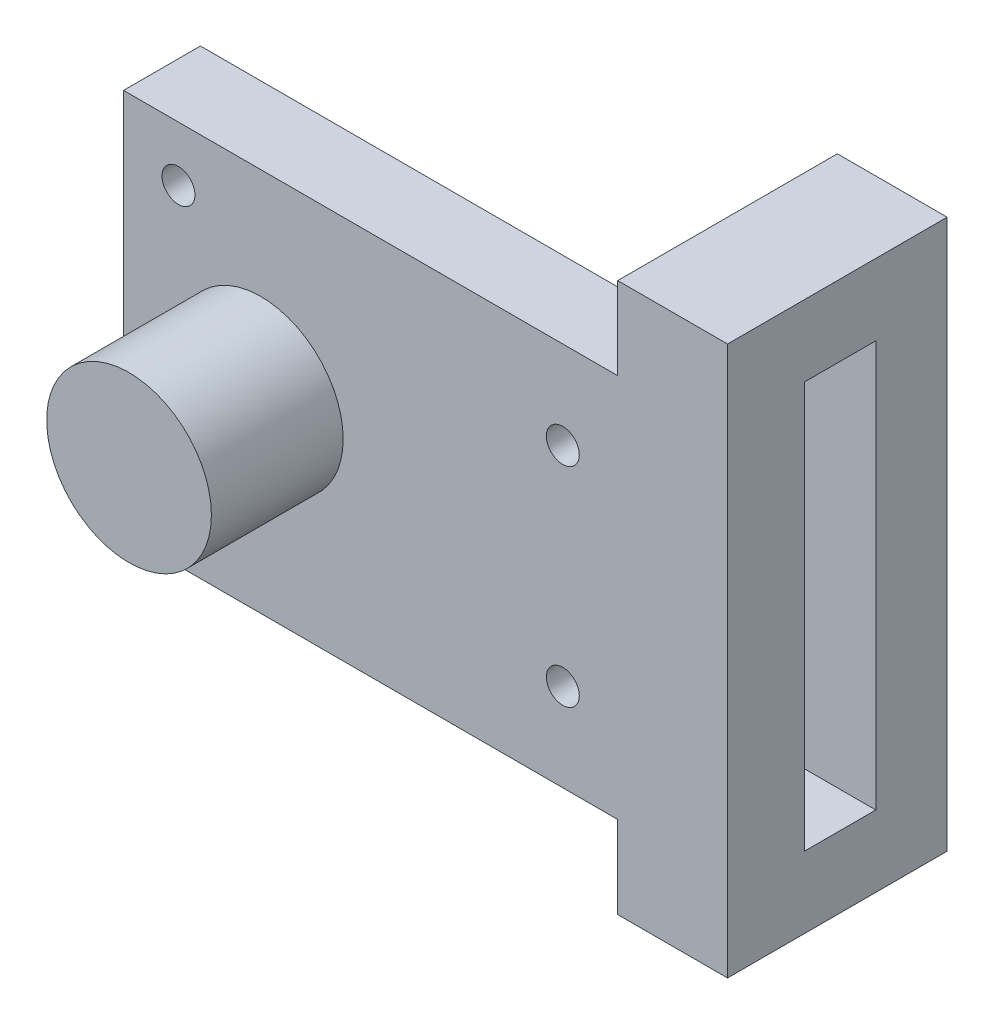
ISO-10303-21;
HEADER;
FILE_DESCRIPTION(('STEP AP214'),'2;1');
FILE_NAME('part.step','',(''),(''),'','','');
FILE_SCHEMA(('AUTOMOTIVE_DESIGN { 1 0 10303 214 1 1 1 1 }'));
ENDSEC;
DATA;
#1=APPLICATION_CONTEXT('core data for automotive mechanical design processes');
#2=APPLICATION_PROTOCOL_DEFINITION('international standard','automotive_design',2000,#1);
#3=PRODUCT_CONTEXT('',#1,'mechanical');
#4=PRODUCT('Part','Part','',(#3));
#5=PRODUCT_RELATED_PRODUCT_CATEGORY('part','',(#4));
#6=PRODUCT_DEFINITION_FORMATION('','',#4);
#7=PRODUCT_DEFINITION_CONTEXT('part definition',#1,'design');
#8=PRODUCT_DEFINITION('design','',#6,#7);
#9=PRODUCT_DEFINITION_SHAPE('','',#8);
#10=(LENGTH_UNIT() NAMED_UNIT(*) SI_UNIT(.MILLI.,.METRE.));
#11=(NAMED_UNIT(*) PLANE_ANGLE_UNIT() SI_UNIT($,.RADIAN.));
#12=(NAMED_UNIT(*) SI_UNIT($,.STERADIAN.) SOLID_ANGLE_UNIT());
#13=UNCERTAINTY_MEASURE_WITH_UNIT(LENGTH_MEASURE(1.E-05),#10,'distance_accuracy_value','');
#14=(GEOMETRIC_REPRESENTATION_CONTEXT(3) GLOBAL_UNCERTAINTY_ASSIGNED_CONTEXT((#13)) GLOBAL_UNIT_ASSIGNED_CONTEXT((#10,
#11,#12)) REPRESENTATION_CONTEXT('',''));
#15=CARTESIAN_POINT('',(0.,0.,0.));
#16=DIRECTION('',(0.,0.,1.));
#17=DIRECTION('',(1.,0.,0.));
#18=AXIS2_PLACEMENT_3D('',#15,#16,#17);
#19=CARTESIAN_POINT('',(0.,0.,0.));
#20=DIRECTION('',(0.,0.,1.));
#21=DIRECTION('',(1.,0.,0.));
#22=AXIS2_PLACEMENT_3D('',#19,#20,#21);
#23=PLANE('',#22);
#24=CARTESIAN_POINT('',(-80.0000000000005,5.96744875736022E-13,0.));
#25=DIRECTION('',(0.,0.,1.));
#26=DIRECTION('',(1.,0.,0.));
#27=AXIS2_PLACEMENT_3D('',#24,#25,#26);
#28=CIRCLE('',#27,4.25000000000001);
#29=CARTESIAN_POINT('',(-75.7500000000005,5.96744875736022E-13,0.));
#30=VERTEX_POINT('',#29);
#31=EDGE_CURVE('E546',#30,#30,#28,.T.);
#32=ORIENTED_EDGE('',*,*,#31,.T.);
#33=EDGE_LOOP('',(#32));
#34=FACE_BOUND('',#33,.T.);
#35=CARTESIAN_POINT('',(-52.5000000000001,-9.5,0.));
#36=DIRECTION('',(0.,0.,1.));
#37=DIRECTION('',(1.,0.,0.));
#38=AXIS2_PLACEMENT_3D('',#35,#36,#37);
#39=CIRCLE('',#38,1.5);
#40=CARTESIAN_POINT('',(-51.,-9.5,0.));
#41=VERTEX_POINT('',#40);
#42=EDGE_CURVE('E236',#41,#41,#39,.T.);
#43=ORIENTED_EDGE('',*,*,#42,.T.);
#44=EDGE_LOOP('',(#43));
#45=FACE_BOUND('',#44,.T.);
#46=CARTESIAN_POINT('',(-52.5000000000001,9.5,0.));
#47=DIRECTION('',(0.,0.,1.));
#48=DIRECTION('',(1.,0.,0.));
#49=AXIS2_PLACEMENT_3D('',#46,#47,#48);
#50=CIRCLE('',#49,1.5);
#51=CARTESIAN_POINT('',(-51.,9.5,0.));
#52=VERTEX_POINT('',#51);
#53=EDGE_CURVE('E268',#52,#52,#50,.T.);
#54=ORIENTED_EDGE('',*,*,#53,.T.);
#55=EDGE_LOOP('',(#54));
#56=FACE_BOUND('',#55,.T.);
#57=CARTESIAN_POINT('',(-87.5000000000001,12.5,0.));
#58=DIRECTION('',(0.,0.,1.));
#59=DIRECTION('',(1.,0.,0.));
#60=AXIS2_PLACEMENT_3D('',#57,#58,#59);
#61=CIRCLE('',#60,1.5);
#62=CARTESIAN_POINT('',(-86.,12.5,0.));
#63=VERTEX_POINT('',#62);
#64=EDGE_CURVE('E284',#63,#63,#61,.T.);
#65=ORIENTED_EDGE('',*,*,#64,.T.);
#66=EDGE_LOOP('',(#65));
#67=FACE_BOUND('',#66,.T.);
#68=CARTESIAN_POINT('',(-87.5000000000001,-12.5,0.));
#69=DIRECTION('',(0.,0.,1.));
#70=DIRECTION('',(1.,0.,0.));
#71=AXIS2_PLACEMENT_3D('',#68,#69,#70);
#72=CIRCLE('',#71,1.5);
#73=CARTESIAN_POINT('',(-86.,-12.5,0.));
#74=VERTEX_POINT('',#73);
#75=EDGE_CURVE('E242',#74,#74,#72,.F.);
#76=ORIENTED_EDGE('',*,*,#75,.F.);
#77=EDGE_LOOP('',(#76));
#78=FACE_BOUND('',#77,.T.);
#79=DIRECTION('',(1.,0.,0.));
#80=VECTOR('',#79,1.);
#81=CARTESIAN_POINT('',(-47.5000000000001,-18.5,0.));
#82=LINE('',#81,#80);
#83=CARTESIAN_POINT('',(-47.5000000000001,-18.5,0.));
#84=VERTEX_POINT('',#83);
#85=CARTESIAN_POINT('',(-37.5,-18.5,0.));
#86=VERTEX_POINT('',#85);
#87=EDGE_CURVE('E177',#84,#86,#82,.T.);
#88=ORIENTED_EDGE('',*,*,#87,.F.);
#89=DIRECTION('',(0.,1.,0.));
#90=VECTOR('',#89,1.);
#91=CARTESIAN_POINT('',(-47.5000000000001,25.,0.));
#92=LINE('',#91,#90);
#93=CARTESIAN_POINT('',(-47.5,-17.5,0.));
#94=VERTEX_POINT('',#93);
#95=EDGE_CURVE('E146',#84,#94,#92,.T.);
#96=ORIENTED_EDGE('',*,*,#95,.T.);
#97=DIRECTION('',(1.,0.,0.));
#98=VECTOR('',#97,1.);
#99=CARTESIAN_POINT('',(0.,-17.5,0.));
#100=LINE('',#99,#98);
#101=CARTESIAN_POINT('',(-92.5000000000001,-17.5,0.));
#102=VERTEX_POINT('',#101);
#103=EDGE_CURVE('E280',#102,#94,#100,.T.);
#104=ORIENTED_EDGE('',*,*,#103,.F.);
#105=DIRECTION('',(0.,-1.,0.));
#106=VECTOR('',#105,1.);
#107=CARTESIAN_POINT('',(-92.5000000000001,0.,0.));
#108=LINE('',#107,#106);
#109=CARTESIAN_POINT('',(-92.5000000000001,17.5,0.));
#110=VERTEX_POINT('',#109);
#111=EDGE_CURVE('E276',#110,#102,#108,.T.);
#112=ORIENTED_EDGE('',*,*,#111,.F.);
#113=DIRECTION('',(1.,0.,0.));
#114=VECTOR('',#113,1.);
#115=CARTESIAN_POINT('',(0.,17.5,0.));
#116=LINE('',#115,#114);
#117=CARTESIAN_POINT('',(-47.5000000000001,17.5,0.));
#118=VERTEX_POINT('',#117);
#119=EDGE_CURVE('E272',#110,#118,#116,.T.);
#120=ORIENTED_EDGE('',*,*,#119,.T.);
#121=CARTESIAN_POINT('',(-47.5000000000001,18.5,0.));
#122=VERTEX_POINT('',#121);
#123=EDGE_CURVE('E211',#118,#122,#92,.T.);
#124=ORIENTED_EDGE('',*,*,#123,.T.);
#125=DIRECTION('',(-1.,0.,0.));
#126=VECTOR('',#125,1.);
#127=CARTESIAN_POINT('',(-47.5000000000001,18.5,0.));
#128=LINE('',#127,#126);
#129=CARTESIAN_POINT('',(-37.5000000000001,18.5,0.));
#130=VERTEX_POINT('',#129);
#131=EDGE_CURVE('E195',#130,#122,#128,.T.);
#132=ORIENTED_EDGE('',*,*,#131,.F.);
#133=DIRECTION('',(0.,1.,0.));
#134=VECTOR('',#133,1.);
#135=CARTESIAN_POINT('',(-37.5000000000001,25.,0.));
#136=LINE('',#135,#134);
#137=EDGE_CURVE('E59',#86,#130,#136,.T.);
#138=ORIENTED_EDGE('',*,*,#137,.F.);
#139=EDGE_LOOP('',(#88,#96,#104,#112,#120,#124,#132,#138));
#140=FACE_BOUND('',#139,.T.);
#141=ADVANCED_FACE('F43',(#34,#45,#56,#67,#78,#140),#23,.F.);
#142=CARTESIAN_POINT('',(0.,17.5,7.));
#143=DIRECTION('',(0.,1.,0.));
#144=DIRECTION('',(0.,0.,1.));
#145=AXIS2_PLACEMENT_3D('',#142,#143,#144);
#146=PLANE('',#145);
#147=ORIENTED_EDGE('',*,*,#119,.F.);
#148=DIRECTION('',(0.,0.,-1.));
#149=VECTOR('',#148,1.);
#150=CARTESIAN_POINT('',(-92.5000000000001,17.5,7.));
#151=LINE('',#150,#149);
#152=CARTESIAN_POINT('',(-92.5000000000001,17.5,7.));
#153=VERTEX_POINT('',#152);
#154=EDGE_CURVE('E52',#153,#110,#151,.T.);
#155=ORIENTED_EDGE('',*,*,#154,.F.);
#156=DIRECTION('',(1.,0.,0.));
#157=VECTOR('',#156,1.);
#158=CARTESIAN_POINT('',(0.,17.5,7.));
#159=LINE('',#158,#157);
#160=CARTESIAN_POINT('',(-47.5000000000001,17.5,7.));
#161=VERTEX_POINT('',#160);
#162=EDGE_CURVE('E246',#153,#161,#159,.T.);
#163=ORIENTED_EDGE('',*,*,#162,.T.);
#164=DIRECTION('',(0.,0.,-1.));
#165=VECTOR('',#164,1.);
#166=CARTESIAN_POINT('',(-47.5000000000001,17.5,7.));
#167=LINE('',#166,#165);
#168=EDGE_CURVE('E11',#161,#118,#167,.T.);
#169=ORIENTED_EDGE('',*,*,#168,.T.);
#170=EDGE_LOOP('',(#147,#155,#163,#169));
#171=FACE_BOUND('',#170,.T.);
#172=ADVANCED_FACE('F307',(#171),#146,.T.);
#173=CARTESIAN_POINT('',(-92.5000000000001,0.,7.));
#174=DIRECTION('',(1.,0.,0.));
#175=DIRECTION('',(0.,0.,-1.));
#176=AXIS2_PLACEMENT_3D('',#173,#174,#175);
#177=PLANE('',#176);
#178=ORIENTED_EDGE('',*,*,#111,.T.);
#179=DIRECTION('',(0.,0.,-1.));
#180=VECTOR('',#179,1.);
#181=CARTESIAN_POINT('',(-92.5000000000001,-17.5,7.));
#182=LINE('',#181,#180);
#183=CARTESIAN_POINT('',(-92.5000000000001,-17.5,7.));
#184=VERTEX_POINT('',#183);
#185=EDGE_CURVE('E294',#184,#102,#182,.T.);
#186=ORIENTED_EDGE('',*,*,#185,.F.);
#187=DIRECTION('',(0.,-1.,0.));
#188=VECTOR('',#187,1.);
#189=CARTESIAN_POINT('',(-92.5000000000001,0.,7.));
#190=LINE('',#189,#188);
#191=EDGE_CURVE('E249',#153,#184,#190,.T.);
#192=ORIENTED_EDGE('',*,*,#191,.F.);
#193=ORIENTED_EDGE('',*,*,#154,.T.);
#194=EDGE_LOOP('',(#178,#186,#192,#193));
#195=FACE_BOUND('',#194,.T.);
#196=ADVANCED_FACE('F301',(#195),#177,.F.);
#197=CARTESIAN_POINT('',(-87.5000000000001,12.5,7.));
#198=DIRECTION('',(0.,0.,-1.));
#199=DIRECTION('',(-1.,0.,0.));
#200=AXIS2_PLACEMENT_3D('',#197,#198,#199);
#201=CYLINDRICAL_SURFACE('',#200,1.5);
#202=CARTESIAN_POINT('',(-87.5000000000001,12.5,7.));
#203=DIRECTION('',(0.,0.,1.));
#204=DIRECTION('',(1.,0.,0.));
#205=AXIS2_PLACEMENT_3D('',#202,#203,#204);
#206=CIRCLE('',#205,1.5);
#207=CARTESIAN_POINT('',(-86.,12.5,7.));
#208=VERTEX_POINT('',#207);
#209=EDGE_CURVE('E256',#208,#208,#206,.T.);
#210=ORIENTED_EDGE('',*,*,#209,.T.);
#211=EDGE_LOOP('',(#210));
#212=FACE_BOUND('',#211,.T.);
#213=ORIENTED_EDGE('',*,*,#64,.F.);
#214=EDGE_LOOP('',(#213));
#215=FACE_BOUND('',#214,.T.);
#216=ADVANCED_FACE('F335',(#212,#215),#201,.F.);
#217=CARTESIAN_POINT('',(0.,-17.5,7.));
#218=DIRECTION('',(0.,1.,0.));
#219=DIRECTION('',(0.,0.,1.));
#220=AXIS2_PLACEMENT_3D('',#217,#218,#219);
#221=PLANE('',#220);
#222=ORIENTED_EDGE('',*,*,#103,.T.);
#223=DIRECTION('',(0.,0.,-1.));
#224=VECTOR('',#223,1.);
#225=CARTESIAN_POINT('',(-47.5,-17.5,7.));
#226=LINE('',#225,#224);
#227=CARTESIAN_POINT('',(-47.5,-17.5,7.));
#228=VERTEX_POINT('',#227);
#229=EDGE_CURVE('E264',#228,#94,#226,.T.);
#230=ORIENTED_EDGE('',*,*,#229,.F.);
#231=DIRECTION('',(1.,0.,0.));
#232=VECTOR('',#231,1.);
#233=CARTESIAN_POINT('',(0.,-17.5,7.));
#234=LINE('',#233,#232);
#235=EDGE_CURVE('E253',#184,#228,#234,.T.);
#236=ORIENTED_EDGE('',*,*,#235,.F.);
#237=ORIENTED_EDGE('',*,*,#185,.T.);
#238=EDGE_LOOP('',(#222,#230,#236,#237));
#239=FACE_BOUND('',#238,.T.);
#240=ADVANCED_FACE('F332',(#239),#221,.F.);
#241=CARTESIAN_POINT('',(-52.5000000000001,9.5,7.));
#242=DIRECTION('',(0.,0.,-1.));
#243=DIRECTION('',(-1.,0.,0.));
#244=AXIS2_PLACEMENT_3D('',#241,#242,#243);
#245=CYLINDRICAL_SURFACE('',#244,1.5);
#246=CARTESIAN_POINT('',(-52.5000000000001,9.5,7.));
#247=DIRECTION('',(0.,0.,1.));
#248=DIRECTION('',(1.,0.,0.));
#249=AXIS2_PLACEMENT_3D('',#246,#247,#248);
#250=CIRCLE('',#249,1.5);
#251=CARTESIAN_POINT('',(-51.,9.5,7.));
#252=VERTEX_POINT('',#251);
#253=EDGE_CURVE('E241',#252,#252,#250,.T.);
#254=ORIENTED_EDGE('',*,*,#253,.T.);
#255=EDGE_LOOP('',(#254));
#256=FACE_BOUND('',#255,.T.);
#257=ORIENTED_EDGE('',*,*,#53,.F.);
#258=EDGE_LOOP('',(#257));
#259=FACE_BOUND('',#258,.T.);
#260=ADVANCED_FACE('F334',(#256,#259),#245,.F.);
#261=CARTESIAN_POINT('',(-52.5000000000001,-9.5,7.));
#262=DIRECTION('',(0.,0.,-1.));
#263=DIRECTION('',(-1.,0.,0.));
#264=AXIS2_PLACEMENT_3D('',#261,#262,#263);
#265=CYLINDRICAL_SURFACE('',#264,1.5);
#266=CARTESIAN_POINT('',(-52.5000000000001,-9.5,7.));
#267=DIRECTION('',(0.,0.,1.));
#268=DIRECTION('',(1.,0.,0.));
#269=AXIS2_PLACEMENT_3D('',#266,#267,#268);
#270=CIRCLE('',#269,1.5);
#271=CARTESIAN_POINT('',(-51.,-9.5,7.));
#272=VERTEX_POINT('',#271);
#273=EDGE_CURVE('E237',#272,#272,#270,.T.);
#274=ORIENTED_EDGE('',*,*,#273,.T.);
#275=EDGE_LOOP('',(#274));
#276=FACE_BOUND('',#275,.T.);
#277=ORIENTED_EDGE('',*,*,#42,.F.);
#278=EDGE_LOOP('',(#277));
#279=FACE_BOUND('',#278,.T.);
#280=ADVANCED_FACE('F45',(#276,#279),#265,.F.);
#281=CARTESIAN_POINT('',(-87.5000000000001,-12.5,7.));
#282=DIRECTION('',(0.,0.,-1.));
#283=DIRECTION('',(-1.,0.,0.));
#284=AXIS2_PLACEMENT_3D('',#281,#282,#283);
#285=CYLINDRICAL_SURFACE('',#284,1.5);
#286=CARTESIAN_POINT('',(-87.5000000000001,-12.5,7.));
#287=DIRECTION('',(0.,0.,1.));
#288=DIRECTION('',(1.,0.,0.));
#289=AXIS2_PLACEMENT_3D('',#286,#287,#288);
#290=CIRCLE('',#289,1.5);
#291=CARTESIAN_POINT('',(-86.,-12.5,7.));
#292=VERTEX_POINT('',#291);
#293=EDGE_CURVE('E260',#292,#292,#290,.F.);
#294=ORIENTED_EDGE('',*,*,#293,.F.);
#295=EDGE_LOOP('',(#294));
#296=FACE_BOUND('',#295,.T.);
#297=ORIENTED_EDGE('',*,*,#75,.T.);
#298=EDGE_LOOP('',(#297));
#299=FACE_BOUND('',#298,.T.);
#300=ADVANCED_FACE('F357',(#296,#299),#285,.F.);
#301=CARTESIAN_POINT('',(0.,0.,7.));
#302=DIRECTION('',(0.,0.,1.));
#303=DIRECTION('',(1.,0.,0.));
#304=AXIS2_PLACEMENT_3D('',#301,#302,#303);
#305=PLANE('',#304);
#306=CARTESIAN_POINT('',(-80.0000000000005,5.96744875736022E-13,7.));
#307=DIRECTION('',(0.,0.,1.));
#308=DIRECTION('',(1.,0.,0.));
#309=AXIS2_PLACEMENT_3D('',#306,#307,#308);
#310=CIRCLE('',#309,7.50000000000001);
#311=CARTESIAN_POINT('',(-72.5000000000005,5.96744875736022E-13,7.));
#312=VERTEX_POINT('',#311);
#313=EDGE_CURVE('E170',#312,#312,#310,.T.);
#314=ORIENTED_EDGE('',*,*,#313,.F.);
#315=EDGE_LOOP('',(#314));
#316=FACE_BOUND('',#315,.T.);
#317=ORIENTED_EDGE('',*,*,#273,.F.);
#318=EDGE_LOOP('',(#317));
#319=FACE_BOUND('',#318,.T.);
#320=ORIENTED_EDGE('',*,*,#253,.F.);
#321=EDGE_LOOP('',(#320));
#322=FACE_BOUND('',#321,.T.);
#323=ORIENTED_EDGE('',*,*,#235,.T.);
#324=DIRECTION('',(0.,-1.,0.));
#325=VECTOR('',#324,1.);
#326=CARTESIAN_POINT('',(-47.5000000000001,25.,7.));
#327=LINE('',#326,#325);
#328=CARTESIAN_POINT('',(-47.5,-25.,6.99999999999999));
#329=VERTEX_POINT('',#328);
#330=EDGE_CURVE('E145',#228,#329,#327,.T.);
#331=ORIENTED_EDGE('',*,*,#330,.T.);
#332=DIRECTION('',(-1.,0.,0.));
#333=VECTOR('',#332,1.);
#334=CARTESIAN_POINT('',(-37.5,-25.,6.99999999999999));
#335=LINE('',#334,#333);
#336=CARTESIAN_POINT('',(-37.5,-25.,6.99999999999999));
#337=VERTEX_POINT('',#336);
#338=EDGE_CURVE('E223',#337,#329,#335,.T.);
#339=ORIENTED_EDGE('',*,*,#338,.F.);
#340=DIRECTION('',(0.,-1.,0.));
#341=VECTOR('',#340,1.);
#342=CARTESIAN_POINT('',(-37.5000000000001,25.,7.));
#343=LINE('',#342,#341);
#344=CARTESIAN_POINT('',(-37.5000000000001,25.,7.));
#345=VERTEX_POINT('',#344);
#346=EDGE_CURVE('E217',#345,#337,#343,.T.);
#347=ORIENTED_EDGE('',*,*,#346,.F.);
#348=DIRECTION('',(-1.,0.,0.));
#349=VECTOR('',#348,1.);
#350=CARTESIAN_POINT('',(-37.5000000000001,25.,7.));
#351=LINE('',#350,#349);
#352=CARTESIAN_POINT('',(-47.5000000000001,25.,7.));
#353=VERTEX_POINT('',#352);
#354=EDGE_CURVE('E233',#345,#353,#351,.T.);
#355=ORIENTED_EDGE('',*,*,#354,.T.);
#356=EDGE_CURVE('E140',#353,#161,#327,.T.);
#357=ORIENTED_EDGE('',*,*,#356,.T.);
#358=ORIENTED_EDGE('',*,*,#162,.F.);
#359=ORIENTED_EDGE('',*,*,#191,.T.);
#360=EDGE_LOOP('',(#323,#331,#339,#347,#355,#357,#358,#359));
#361=FACE_BOUND('',#360,.T.);
#362=ORIENTED_EDGE('',*,*,#209,.F.);
#363=EDGE_LOOP('',(#362));
#364=FACE_BOUND('',#363,.T.);
#365=ORIENTED_EDGE('',*,*,#293,.T.);
#366=EDGE_LOOP('',(#365));
#367=FACE_BOUND('',#366,.T.);
#368=ADVANCED_FACE('F309',(#316,#319,#322,#361,#364,#367),#305,.T.);
#369=CARTESIAN_POINT('',(-47.5,0.,0.));
#370=DIRECTION('',(-1.,0.,0.));
#371=DIRECTION('',(0.,-1.,0.));
#372=AXIS2_PLACEMENT_3D('',#369,#370,#371);
#373=PLANE('',#372);
#374=ORIENTED_EDGE('',*,*,#168,.F.);
#375=ORIENTED_EDGE('',*,*,#356,.F.);
#376=DIRECTION('',(0.,0.,1.));
#377=VECTOR('',#376,1.);
#378=CARTESIAN_POINT('',(-47.5000000000001,25.,0.));
#379=LINE('',#378,#377);
#380=CARTESIAN_POINT('',(-47.5000000000001,25.,-13.));
#381=VERTEX_POINT('',#380);
#382=EDGE_CURVE('E132',#381,#353,#379,.T.);
#383=ORIENTED_EDGE('',*,*,#382,.F.);
#384=DIRECTION('',(0.,1.,0.));
#385=VECTOR('',#384,1.);
#386=CARTESIAN_POINT('',(-47.5000000000001,25.,-13.));
#387=LINE('',#386,#385);
#388=CARTESIAN_POINT('',(-47.5000000000001,-25.,-13.));
#389=VERTEX_POINT('',#388);
#390=EDGE_CURVE('E138',#389,#381,#387,.T.);
#391=ORIENTED_EDGE('',*,*,#390,.F.);
#392=DIRECTION('',(0.,0.,-1.));
#393=VECTOR('',#392,1.);
#394=CARTESIAN_POINT('',(-47.5,-25.,0.));
#395=LINE('',#394,#393);
#396=EDGE_CURVE('E214',#329,#389,#395,.T.);
#397=ORIENTED_EDGE('',*,*,#396,.F.);
#398=ORIENTED_EDGE('',*,*,#330,.F.);
#399=ORIENTED_EDGE('',*,*,#229,.T.);
#400=ORIENTED_EDGE('',*,*,#95,.F.);
#401=DIRECTION('',(0.,0.,1.));
#402=VECTOR('',#401,1.);
#403=CARTESIAN_POINT('',(-47.5000000000001,-18.5,-6.5));
#404=LINE('',#403,#402);
#405=CARTESIAN_POINT('',(-47.5000000000001,-18.5,-6.5));
#406=VERTEX_POINT('',#405);
#407=EDGE_CURVE('E191',#406,#84,#404,.T.);
#408=ORIENTED_EDGE('',*,*,#407,.F.);
#409=DIRECTION('',(0.,1.,0.));
#410=VECTOR('',#409,1.);
#411=CARTESIAN_POINT('',(-47.5000000000001,25.,-6.5));
#412=LINE('',#411,#410);
#413=CARTESIAN_POINT('',(-47.5000000000001,18.5,-6.5));
#414=VERTEX_POINT('',#413);
#415=EDGE_CURVE('E167',#406,#414,#412,.T.);
#416=ORIENTED_EDGE('',*,*,#415,.T.);
#417=DIRECTION('',(0.,0.,1.));
#418=VECTOR('',#417,1.);
#419=CARTESIAN_POINT('',(-47.5000000000001,18.5,-6.5));
#420=LINE('',#419,#418);
#421=EDGE_CURVE('E200',#414,#122,#420,.T.);
#422=ORIENTED_EDGE('',*,*,#421,.T.);
#423=ORIENTED_EDGE('',*,*,#123,.F.);
#424=EDGE_LOOP('',(#374,#375,#383,#391,#397,#398,#399,#400,#408,#416,#422,#423));
#425=FACE_BOUND('',#424,.T.);
#426=ADVANCED_FACE('F135',(#425),#373,.T.);
#427=CARTESIAN_POINT('',(-37.5000000000001,25.,0.));
#428=DIRECTION('',(0.,-1.,0.));
#429=DIRECTION('',(1.,0.,0.));
#430=AXIS2_PLACEMENT_3D('',#427,#428,#429);
#431=PLANE('',#430);
#432=ORIENTED_EDGE('',*,*,#382,.T.);
#433=ORIENTED_EDGE('',*,*,#354,.F.);
#434=DIRECTION('',(0.,0.,1.));
#435=VECTOR('',#434,1.);
#436=CARTESIAN_POINT('',(-37.5000000000001,25.,0.));
#437=LINE('',#436,#435);
#438=CARTESIAN_POINT('',(-37.5000000000001,25.,-13.));
#439=VERTEX_POINT('',#438);
#440=EDGE_CURVE('E151',#439,#345,#437,.T.);
#441=ORIENTED_EDGE('',*,*,#440,.F.);
#442=DIRECTION('',(1.,0.,0.));
#443=VECTOR('',#442,1.);
#444=CARTESIAN_POINT('',(-47.5000000000001,25.,-13.));
#445=LINE('',#444,#443);
#446=EDGE_CURVE('E149',#381,#439,#445,.T.);
#447=ORIENTED_EDGE('',*,*,#446,.F.);
#448=EDGE_LOOP('',(#432,#433,#441,#447));
#449=FACE_BOUND('',#448,.T.);
#450=ADVANCED_FACE('F150',(#449),#431,.F.);
#451=CARTESIAN_POINT('',(-37.5,-25.,0.));
#452=DIRECTION('',(0.,1.,0.));
#453=DIRECTION('',(0.,0.,1.));
#454=AXIS2_PLACEMENT_3D('',#451,#452,#453);
#455=PLANE('',#454);
#456=ORIENTED_EDGE('',*,*,#396,.T.);
#457=DIRECTION('',(-1.,0.,0.));
#458=VECTOR('',#457,1.);
#459=CARTESIAN_POINT('',(-47.5000000000001,-25.,-13.));
#460=LINE('',#459,#458);
#461=CARTESIAN_POINT('',(-37.5000000000001,-25.,-13.));
#462=VERTEX_POINT('',#461);
#463=EDGE_CURVE('E161',#462,#389,#460,.T.);
#464=ORIENTED_EDGE('',*,*,#463,.F.);
#465=DIRECTION('',(0.,0.,-1.));
#466=VECTOR('',#465,1.);
#467=CARTESIAN_POINT('',(-37.5,-25.,0.));
#468=LINE('',#467,#466);
#469=EDGE_CURVE('E220',#337,#462,#468,.T.);
#470=ORIENTED_EDGE('',*,*,#469,.F.);
#471=ORIENTED_EDGE('',*,*,#338,.T.);
#472=EDGE_LOOP('',(#456,#464,#470,#471));
#473=FACE_BOUND('',#472,.T.);
#474=ADVANCED_FACE('F317',(#473),#455,.F.);
#475=CARTESIAN_POINT('',(-37.5,0.,0.));
#476=DIRECTION('',(-1.,0.,0.));
#477=DIRECTION('',(0.,-1.,0.));
#478=AXIS2_PLACEMENT_3D('',#475,#476,#477);
#479=PLANE('',#478);
#480=DIRECTION('',(0.,0.,1.));
#481=VECTOR('',#480,1.);
#482=CARTESIAN_POINT('',(-37.5,18.5,-6.5));
#483=LINE('',#482,#481);
#484=CARTESIAN_POINT('',(-37.5000000000001,18.5,-6.5));
#485=VERTEX_POINT('',#484);
#486=EDGE_CURVE('E207',#485,#130,#483,.T.);
#487=ORIENTED_EDGE('',*,*,#486,.F.);
#488=DIRECTION('',(0.,-1.,0.));
#489=VECTOR('',#488,1.);
#490=CARTESIAN_POINT('',(-37.5000000000001,25.,-6.5));
#491=LINE('',#490,#489);
#492=CARTESIAN_POINT('',(-37.5,-18.5,-6.5));
#493=VERTEX_POINT('',#492);
#494=EDGE_CURVE('E163',#485,#493,#491,.T.);
#495=ORIENTED_EDGE('',*,*,#494,.T.);
#496=DIRECTION('',(0.,0.,1.));
#497=VECTOR('',#496,1.);
#498=CARTESIAN_POINT('',(-37.5,-18.5,-6.5));
#499=LINE('',#498,#497);
#500=EDGE_CURVE('E186',#493,#86,#499,.T.);
#501=ORIENTED_EDGE('',*,*,#500,.T.);
#502=ORIENTED_EDGE('',*,*,#137,.T.);
#503=EDGE_LOOP('',(#487,#495,#501,#502));
#504=FACE_BOUND('',#503,.T.);
#505=ORIENTED_EDGE('',*,*,#469,.T.);
#506=DIRECTION('',(0.,-1.,0.));
#507=VECTOR('',#506,1.);
#508=CARTESIAN_POINT('',(-37.5000000000001,25.,-13.));
#509=LINE('',#508,#507);
#510=EDGE_CURVE('E156',#439,#462,#509,.T.);
#511=ORIENTED_EDGE('',*,*,#510,.F.);
#512=ORIENTED_EDGE('',*,*,#440,.T.);
#513=ORIENTED_EDGE('',*,*,#346,.T.);
#514=EDGE_LOOP('',(#505,#511,#512,#513));
#515=FACE_BOUND('',#514,.T.);
#516=ADVANCED_FACE('F315',(#504,#515),#479,.F.);
#517=CARTESIAN_POINT('',(-47.5000000000001,18.5,-6.5));
#518=DIRECTION('',(0.,1.,0.));
#519=DIRECTION('',(-1.,0.,0.));
#520=AXIS2_PLACEMENT_3D('',#517,#518,#519);
#521=PLANE('',#520);
#522=ORIENTED_EDGE('',*,*,#131,.T.);
#523=ORIENTED_EDGE('',*,*,#421,.F.);
#524=DIRECTION('',(-1.,0.,0.));
#525=VECTOR('',#524,1.);
#526=CARTESIAN_POINT('',(-47.5000000000001,18.5,-6.5));
#527=LINE('',#526,#525);
#528=EDGE_CURVE('E196',#485,#414,#527,.T.);
#529=ORIENTED_EDGE('',*,*,#528,.F.);
#530=ORIENTED_EDGE('',*,*,#486,.T.);
#531=EDGE_LOOP('',(#522,#523,#529,#530));
#532=FACE_BOUND('',#531,.T.);
#533=ADVANCED_FACE('F323',(#532),#521,.F.);
#534=CARTESIAN_POINT('',(-47.5000000000001,-18.5,-6.5));
#535=DIRECTION('',(0.,-1.,0.));
#536=DIRECTION('',(1.,0.,0.));
#537=AXIS2_PLACEMENT_3D('',#534,#535,#536);
#538=PLANE('',#537);
#539=ORIENTED_EDGE('',*,*,#87,.T.);
#540=ORIENTED_EDGE('',*,*,#500,.F.);
#541=DIRECTION('',(1.,0.,0.));
#542=VECTOR('',#541,1.);
#543=CARTESIAN_POINT('',(-47.5000000000001,-18.5,-6.5));
#544=LINE('',#543,#542);
#545=EDGE_CURVE('E182',#406,#493,#544,.T.);
#546=ORIENTED_EDGE('',*,*,#545,.F.);
#547=ORIENTED_EDGE('',*,*,#407,.T.);
#548=EDGE_LOOP('',(#539,#540,#546,#547));
#549=FACE_BOUND('',#548,.T.);
#550=ADVANCED_FACE('F330',(#549),#538,.F.);
#551=CARTESIAN_POINT('',(0.,0.,-6.5));
#552=DIRECTION('',(0.,0.,1.));
#553=DIRECTION('',(1.,0.,0.));
#554=AXIS2_PLACEMENT_3D('',#551,#552,#553);
#555=PLANE('',#554);
#556=ORIENTED_EDGE('',*,*,#528,.T.);
#557=ORIENTED_EDGE('',*,*,#415,.F.);
#558=ORIENTED_EDGE('',*,*,#545,.T.);
#559=ORIENTED_EDGE('',*,*,#494,.F.);
#560=EDGE_LOOP('',(#556,#557,#558,#559));
#561=FACE_BOUND('',#560,.T.);
#562=ADVANCED_FACE('F327',(#561),#555,.T.);
#563=CARTESIAN_POINT('',(0.,0.,-13.));
#564=DIRECTION('',(0.,0.,1.));
#565=DIRECTION('',(1.,0.,0.));
#566=AXIS2_PLACEMENT_3D('',#563,#564,#565);
#567=PLANE('',#566);
#568=ORIENTED_EDGE('',*,*,#390,.T.);
#569=ORIENTED_EDGE('',*,*,#446,.T.);
#570=ORIENTED_EDGE('',*,*,#510,.T.);
#571=ORIENTED_EDGE('',*,*,#463,.T.);
#572=EDGE_LOOP('',(#568,#569,#570,#571));
#573=FACE_BOUND('',#572,.T.);
#574=ADVANCED_FACE('F159',(#573),#567,.F.);
#575=CARTESIAN_POINT('',(-80.0000000000005,5.96744875736022E-13,19.));
#576=DIRECTION('',(0.,0.,-1.));
#577=DIRECTION('',(-1.,0.,0.));
#578=AXIS2_PLACEMENT_3D('',#575,#576,#577);
#579=CYLINDRICAL_SURFACE('',#578,7.50000000000001);
#580=CARTESIAN_POINT('',(-80.0000000000005,5.96744875736022E-13,19.));
#581=DIRECTION('',(0.,0.,1.));
#582=DIRECTION('',(1.,0.,0.));
#583=AXIS2_PLACEMENT_3D('',#580,#581,#582);
#584=CIRCLE('',#583,7.50000000000001);
#585=CARTESIAN_POINT('',(-72.5000000000005,5.96744875736022E-13,19.));
#586=VERTEX_POINT('',#585);
#587=EDGE_CURVE('E180',#586,#586,#584,.T.);
#588=ORIENTED_EDGE('',*,*,#587,.F.);
#589=EDGE_LOOP('',(#588));
#590=FACE_BOUND('',#589,.T.);
#591=ORIENTED_EDGE('',*,*,#313,.T.);
#592=EDGE_LOOP('',(#591));
#593=FACE_BOUND('',#592,.T.);
#594=ADVANCED_FACE('F482',(#590,#593),#579,.T.);
#595=CARTESIAN_POINT('',(-80.0000000000005,5.96744875736022E-13,19.));
#596=DIRECTION('',(0.,0.,1.));
#597=DIRECTION('',(1.,0.,0.));
#598=AXIS2_PLACEMENT_3D('',#595,#596,#597);
#599=PLANE('',#598);
#600=ORIENTED_EDGE('',*,*,#587,.T.);
#601=EDGE_LOOP('',(#600));
#602=FACE_BOUND('',#601,.T.);
#603=ADVANCED_FACE('F499',(#602),#599,.T.);
#604=CARTESIAN_POINT('',(-80.0000000000005,5.96744875736022E-13,16.));
#605=DIRECTION('',(0.,0.,-1.));
#606=DIRECTION('',(-1.,0.,0.));
#607=AXIS2_PLACEMENT_3D('',#604,#605,#606);
#608=CYLINDRICAL_SURFACE('',#607,4.25000000000001);
#609=CARTESIAN_POINT('',(-80.0000000000005,5.96744875736022E-13,16.));
#610=DIRECTION('',(0.,0.,1.));
#611=DIRECTION('',(1.,0.,0.));
#612=AXIS2_PLACEMENT_3D('',#609,#610,#611);
#613=CIRCLE('',#612,4.25000000000001);
#614=CARTESIAN_POINT('',(-75.7500000000005,5.96744875736022E-13,16.));
#615=VERTEX_POINT('',#614);
#616=EDGE_CURVE('E544',#615,#615,#613,.T.);
#617=ORIENTED_EDGE('',*,*,#616,.T.);
#618=EDGE_LOOP('',(#617));
#619=FACE_BOUND('',#618,.T.);
#620=ORIENTED_EDGE('',*,*,#31,.F.);
#621=EDGE_LOOP('',(#620));
#622=FACE_BOUND('',#621,.T.);
#623=ADVANCED_FACE('F508',(#619,#622),#608,.F.);
#624=CARTESIAN_POINT('',(0.,0.,16.));
#625=DIRECTION('',(0.,0.,1.));
#626=DIRECTION('',(1.,0.,0.));
#627=AXIS2_PLACEMENT_3D('',#624,#625,#626);
#628=PLANE('',#627);
#629=ORIENTED_EDGE('',*,*,#616,.F.);
#630=EDGE_LOOP('',(#629));
#631=FACE_BOUND('',#630,.T.);
#632=ADVANCED_FACE('F525',(#631),#628,.F.);
#633=CLOSED_SHELL('',(#141,#172,#196,#216,#240,#260,#280,#300,#368,#426,#450,#474,#516,#533,
#550,#562,#574,#594,#603,#623,#632));
#634=MANIFOLD_SOLID_BREP('B2',#633);
#635=ADVANCED_BREP_SHAPE_REPRESENTATION('',(#18,#634),#14);
#636=SHAPE_DEFINITION_REPRESENTATION(#9,#635);
ENDSEC;
END-ISO-10303-21;
